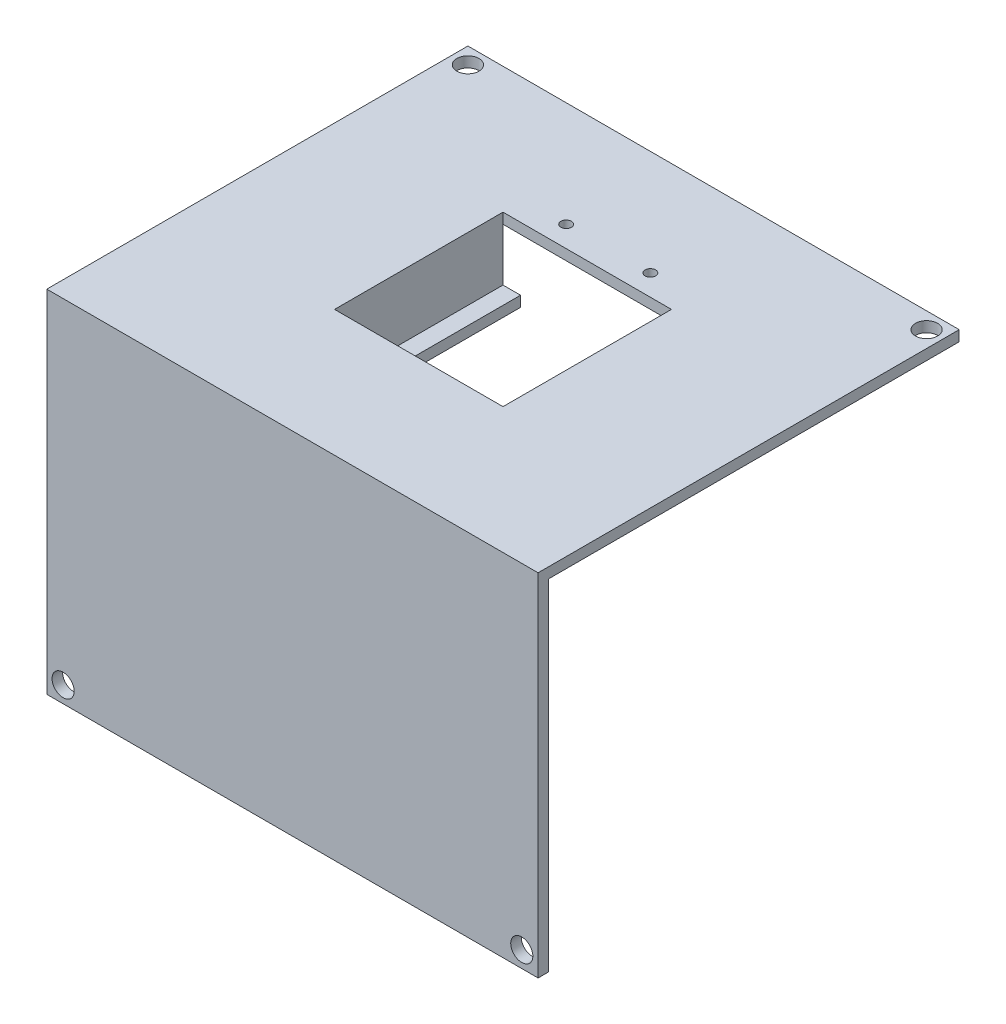
ISO-10303-21;
HEADER;
FILE_DESCRIPTION(('STEP AP214'),'2;1');
FILE_NAME('part.step','',(''),(''),'','','');
FILE_SCHEMA(('AUTOMOTIVE_DESIGN { 1 0 10303 214 1 1 1 1 }'));
ENDSEC;
DATA;
#1=APPLICATION_CONTEXT('core data for automotive mechanical design processes');
#2=APPLICATION_PROTOCOL_DEFINITION('international standard','automotive_design',2000,#1);
#3=PRODUCT_CONTEXT('',#1,'mechanical');
#4=PRODUCT('Part','Part','',(#3));
#5=PRODUCT_RELATED_PRODUCT_CATEGORY('part','',(#4));
#6=PRODUCT_DEFINITION_FORMATION('','',#4);
#7=PRODUCT_DEFINITION_CONTEXT('part definition',#1,'design');
#8=PRODUCT_DEFINITION('design','',#6,#7);
#9=PRODUCT_DEFINITION_SHAPE('','',#8);
#10=(LENGTH_UNIT() NAMED_UNIT(*) SI_UNIT(.MILLI.,.METRE.));
#11=(NAMED_UNIT(*) PLANE_ANGLE_UNIT() SI_UNIT($,.RADIAN.));
#12=(NAMED_UNIT(*) SI_UNIT($,.STERADIAN.) SOLID_ANGLE_UNIT());
#13=UNCERTAINTY_MEASURE_WITH_UNIT(LENGTH_MEASURE(1.E-05),#10,'distance_accuracy_value','');
#14=(GEOMETRIC_REPRESENTATION_CONTEXT(3) GLOBAL_UNCERTAINTY_ASSIGNED_CONTEXT((#13)) GLOBAL_UNIT_ASSIGNED_CONTEXT((#10,
#11,#12)) REPRESENTATION_CONTEXT('',''));
#15=CARTESIAN_POINT('',(0.,0.,0.));
#16=DIRECTION('',(0.,0.,1.));
#17=DIRECTION('',(1.,0.,0.));
#18=AXIS2_PLACEMENT_3D('',#15,#16,#17);
#19=CARTESIAN_POINT('',(0.,97.,0.));
#20=DIRECTION('',(0.,1.,0.));
#21=DIRECTION('',(0.,0.,1.));
#22=AXIS2_PLACEMENT_3D('',#19,#20,#21);
#23=PLANE('',#22);
#24=CARTESIAN_POINT('',(-12.,97.,-30.));
#25=DIRECTION('',(0.,-1.,0.));
#26=DIRECTION('',(0.,0.,-1.));
#27=AXIS2_PLACEMENT_3D('',#24,#25,#26);
#28=CIRCLE('',#27,1.49999999999999);
#29=CARTESIAN_POINT('',(-12.,97.,-31.5));
#30=VERTEX_POINT('',#29);
#31=EDGE_CURVE('E577',#30,#30,#28,.T.);
#32=ORIENTED_EDGE('',*,*,#31,.F.);
#33=EDGE_LOOP('',(#32));
#34=FACE_BOUND('',#33,.T.);
#35=CARTESIAN_POINT('',(12.,97.,-30.));
#36=DIRECTION('',(0.,-1.,0.));
#37=DIRECTION('',(0.,0.,-1.));
#38=AXIS2_PLACEMENT_3D('',#35,#36,#37);
#39=CIRCLE('',#38,1.49999999999999);
#40=CARTESIAN_POINT('',(12.,97.,-31.5));
#41=VERTEX_POINT('',#40);
#42=EDGE_CURVE('E581',#41,#41,#39,.T.);
#43=ORIENTED_EDGE('',*,*,#42,.F.);
#44=EDGE_LOOP('',(#43));
#45=FACE_BOUND('',#44,.T.);
#46=CARTESIAN_POINT('',(65.35,97.,-55.35));
#47=DIRECTION('',(0.,1.,0.));
#48=DIRECTION('',(0.,0.,1.));
#49=AXIS2_PLACEMENT_3D('',#46,#47,#48);
#50=CIRCLE('',#49,3.15);
#51=CARTESIAN_POINT('',(65.35,97.,-52.2));
#52=VERTEX_POINT('',#51);
#53=EDGE_CURVE('E349',#52,#52,#50,.T.);
#54=ORIENTED_EDGE('',*,*,#53,.T.);
#55=EDGE_LOOP('',(#54));
#56=FACE_BOUND('',#55,.T.);
#57=CARTESIAN_POINT('',(-65.3500000000001,97.,-55.35));
#58=DIRECTION('',(0.,1.,0.));
#59=DIRECTION('',(0.,0.,1.));
#60=AXIS2_PLACEMENT_3D('',#57,#58,#59);
#61=CIRCLE('',#60,3.15);
#62=CARTESIAN_POINT('',(-65.3500000000001,97.,-52.2));
#63=VERTEX_POINT('',#62);
#64=EDGE_CURVE('E338',#63,#63,#61,.T.);
#65=ORIENTED_EDGE('',*,*,#64,.T.);
#66=EDGE_LOOP('',(#65));
#67=FACE_BOUND('',#66,.T.);
#68=DIRECTION('',(0.,0.,-1.));
#69=VECTOR('',#68,1.);
#70=CARTESIAN_POINT('',(70.,97.,-60.));
#71=LINE('',#70,#69);
#72=CARTESIAN_POINT('',(70.,97.,57.));
#73=VERTEX_POINT('',#72);
#74=CARTESIAN_POINT('',(70.,97.,-60.));
#75=VERTEX_POINT('',#74);
#76=EDGE_CURVE('E389',#73,#75,#71,.T.);
#77=ORIENTED_EDGE('',*,*,#76,.F.);
#78=DIRECTION('',(1.,0.,0.));
#79=VECTOR('',#78,1.);
#80=CARTESIAN_POINT('',(-70.,97.,57.));
#81=LINE('',#80,#79);
#82=CARTESIAN_POINT('',(-70.,97.,57.));
#83=VERTEX_POINT('',#82);
#84=EDGE_CURVE('E381',#83,#73,#81,.T.);
#85=ORIENTED_EDGE('',*,*,#84,.F.);
#86=DIRECTION('',(0.,0.,1.));
#87=VECTOR('',#86,1.);
#88=CARTESIAN_POINT('',(-70.,97.,-60.));
#89=LINE('',#88,#87);
#90=CARTESIAN_POINT('',(-70.,97.,-60.));
#91=VERTEX_POINT('',#90);
#92=EDGE_CURVE('E385',#91,#83,#89,.T.);
#93=ORIENTED_EDGE('',*,*,#92,.F.);
#94=DIRECTION('',(-1.,0.,0.));
#95=VECTOR('',#94,1.);
#96=CARTESIAN_POINT('',(-70.,97.,-60.));
#97=LINE('',#96,#95);
#98=EDGE_CURVE('E398',#75,#91,#97,.T.);
#99=ORIENTED_EDGE('',*,*,#98,.F.);
#100=EDGE_LOOP('',(#77,#85,#93,#99));
#101=FACE_BOUND('',#100,.T.);
#102=DIRECTION('',(-1.,0.,0.));
#103=VECTOR('',#102,1.);
#104=CARTESIAN_POINT('',(-24.,97.,24.));
#105=LINE('',#104,#103);
#106=CARTESIAN_POINT('',(-24.,97.,24.));
#107=VERTEX_POINT('',#106);
#108=CARTESIAN_POINT('',(-29.,97.,24.));
#109=VERTEX_POINT('',#108);
#110=EDGE_CURVE('E186',#107,#109,#105,.T.);
#111=ORIENTED_EDGE('',*,*,#110,.F.);
#112=DIRECTION('',(-1.,0.,0.));
#113=VECTOR('',#112,1.);
#114=CARTESIAN_POINT('',(-24.,97.,24.));
#115=LINE('',#114,#113);
#116=CARTESIAN_POINT('',(24.,97.,24.));
#117=VERTEX_POINT('',#116);
#118=EDGE_CURVE('E311',#117,#107,#115,.T.);
#119=ORIENTED_EDGE('',*,*,#118,.F.);
#120=DIRECTION('',(-1.,0.,0.));
#121=VECTOR('',#120,1.);
#122=CARTESIAN_POINT('',(24.,97.,24.));
#123=LINE('',#122,#121);
#124=CARTESIAN_POINT('',(29.,97.,24.));
#125=VERTEX_POINT('',#124);
#126=EDGE_CURVE('E291',#125,#117,#123,.T.);
#127=ORIENTED_EDGE('',*,*,#126,.F.);
#128=DIRECTION('',(0.,0.,1.));
#129=VECTOR('',#128,1.);
#130=CARTESIAN_POINT('',(29.,97.,24.));
#131=LINE('',#130,#129);
#132=CARTESIAN_POINT('',(29.,97.,-24.));
#133=VERTEX_POINT('',#132);
#134=EDGE_CURVE('E295',#133,#125,#131,.T.);
#135=ORIENTED_EDGE('',*,*,#134,.F.);
#136=DIRECTION('',(1.,0.,0.));
#137=VECTOR('',#136,1.);
#138=CARTESIAN_POINT('',(29.,97.,-24.));
#139=LINE('',#138,#137);
#140=CARTESIAN_POINT('',(24.,97.,-24.));
#141=VERTEX_POINT('',#140);
#142=EDGE_CURVE('E190',#141,#133,#139,.T.);
#143=ORIENTED_EDGE('',*,*,#142,.F.);
#144=DIRECTION('',(1.,0.,0.));
#145=VECTOR('',#144,1.);
#146=CARTESIAN_POINT('',(-24.,97.,-24.));
#147=LINE('',#146,#145);
#148=CARTESIAN_POINT('',(-24.,97.,-24.));
#149=VERTEX_POINT('',#148);
#150=EDGE_CURVE('E317',#149,#141,#147,.T.);
#151=ORIENTED_EDGE('',*,*,#150,.F.);
#152=DIRECTION('',(1.,0.,0.));
#153=VECTOR('',#152,1.);
#154=CARTESIAN_POINT('',(-29.,97.,-24.));
#155=LINE('',#154,#153);
#156=CARTESIAN_POINT('',(-29.,97.,-24.));
#157=VERTEX_POINT('',#156);
#158=EDGE_CURVE('E270',#157,#149,#155,.T.);
#159=ORIENTED_EDGE('',*,*,#158,.F.);
#160=DIRECTION('',(0.,0.,-1.));
#161=VECTOR('',#160,1.);
#162=CARTESIAN_POINT('',(-29.,97.,24.));
#163=LINE('',#162,#161);
#164=EDGE_CURVE('E273',#109,#157,#163,.T.);
#165=ORIENTED_EDGE('',*,*,#164,.F.);
#166=EDGE_LOOP('',(#111,#119,#127,#135,#143,#151,#159,#165));
#167=FACE_BOUND('',#166,.T.);
#168=ADVANCED_FACE('F39',(#34,#45,#56,#67,#101,#167),#23,.F.);
#169=CARTESIAN_POINT('',(70.,100.,-60.));
#170=DIRECTION('',(-1.,0.,0.));
#171=DIRECTION('',(0.,0.,1.));
#172=AXIS2_PLACEMENT_3D('',#169,#170,#171);
#173=PLANE('',#172);
#174=DIRECTION('',(0.,-1.,0.));
#175=VECTOR('',#174,1.);
#176=CARTESIAN_POINT('',(70.,100.,57.));
#177=LINE('',#176,#175);
#178=CARTESIAN_POINT('',(70.,0.,57.));
#179=VERTEX_POINT('',#178);
#180=EDGE_CURVE('E384',#73,#179,#177,.T.);
#181=ORIENTED_EDGE('',*,*,#180,.F.);
#182=ORIENTED_EDGE('',*,*,#76,.T.);
#183=DIRECTION('',(0.,-1.,0.));
#184=VECTOR('',#183,1.);
#185=CARTESIAN_POINT('',(70.,100.,-60.));
#186=LINE('',#185,#184);
#187=CARTESIAN_POINT('',(70.,100.,-60.));
#188=VERTEX_POINT('',#187);
#189=EDGE_CURVE('E11',#188,#75,#186,.T.);
#190=ORIENTED_EDGE('',*,*,#189,.F.);
#191=DIRECTION('',(0.,0.,-1.));
#192=VECTOR('',#191,1.);
#193=CARTESIAN_POINT('',(70.,100.,-60.));
#194=LINE('',#193,#192);
#195=CARTESIAN_POINT('',(70.,100.,60.));
#196=VERTEX_POINT('',#195);
#197=EDGE_CURVE('E407',#196,#188,#194,.T.);
#198=ORIENTED_EDGE('',*,*,#197,.F.);
#199=DIRECTION('',(0.,-1.,0.));
#200=VECTOR('',#199,1.);
#201=CARTESIAN_POINT('',(70.,100.,60.));
#202=LINE('',#201,#200);
#203=CARTESIAN_POINT('',(70.,0.,60.));
#204=VERTEX_POINT('',#203);
#205=EDGE_CURVE('E421',#196,#204,#202,.T.);
#206=ORIENTED_EDGE('',*,*,#205,.T.);
#207=DIRECTION('',(0.,0.,-1.));
#208=VECTOR('',#207,1.);
#209=CARTESIAN_POINT('',(70.,0.,-60.));
#210=LINE('',#209,#208);
#211=EDGE_CURVE('E394',#204,#179,#210,.T.);
#212=ORIENTED_EDGE('',*,*,#211,.T.);
#213=EDGE_LOOP('',(#181,#182,#190,#198,#206,#212));
#214=FACE_BOUND('',#213,.T.);
#215=ADVANCED_FACE('F41',(#214),#173,.F.);
#216=CARTESIAN_POINT('',(-70.,100.,-60.));
#217=DIRECTION('',(0.,0.,1.));
#218=DIRECTION('',(1.,0.,0.));
#219=AXIS2_PLACEMENT_3D('',#216,#217,#218);
#220=PLANE('',#219);
#221=ORIENTED_EDGE('',*,*,#189,.T.);
#222=ORIENTED_EDGE('',*,*,#98,.T.);
#223=DIRECTION('',(0.,-1.,0.));
#224=VECTOR('',#223,1.);
#225=CARTESIAN_POINT('',(-70.,100.,-60.));
#226=LINE('',#225,#224);
#227=CARTESIAN_POINT('',(-70.,100.,-60.));
#228=VERTEX_POINT('',#227);
#229=EDGE_CURVE('E49',#228,#91,#226,.T.);
#230=ORIENTED_EDGE('',*,*,#229,.F.);
#231=DIRECTION('',(-1.,0.,0.));
#232=VECTOR('',#231,1.);
#233=CARTESIAN_POINT('',(-70.,100.,-60.));
#234=LINE('',#233,#232);
#235=EDGE_CURVE('E411',#188,#228,#234,.T.);
#236=ORIENTED_EDGE('',*,*,#235,.F.);
#237=EDGE_LOOP('',(#221,#222,#230,#236));
#238=FACE_BOUND('',#237,.T.);
#239=ADVANCED_FACE('F445',(#238),#220,.F.);
#240=CARTESIAN_POINT('',(-70.,100.,-60.));
#241=DIRECTION('',(1.,0.,0.));
#242=DIRECTION('',(0.,0.,-1.));
#243=AXIS2_PLACEMENT_3D('',#240,#241,#242);
#244=PLANE('',#243);
#245=ORIENTED_EDGE('',*,*,#92,.T.);
#246=DIRECTION('',(0.,-1.,0.));
#247=VECTOR('',#246,1.);
#248=CARTESIAN_POINT('',(-70.,100.,57.));
#249=LINE('',#248,#247);
#250=CARTESIAN_POINT('',(-70.,0.,57.));
#251=VERTEX_POINT('',#250);
#252=EDGE_CURVE('E390',#83,#251,#249,.T.);
#253=ORIENTED_EDGE('',*,*,#252,.T.);
#254=DIRECTION('',(0.,0.,1.));
#255=VECTOR('',#254,1.);
#256=CARTESIAN_POINT('',(-70.,0.,-60.));
#257=LINE('',#256,#255);
#258=CARTESIAN_POINT('',(-70.,0.,60.));
#259=VERTEX_POINT('',#258);
#260=EDGE_CURVE('E425',#251,#259,#257,.T.);
#261=ORIENTED_EDGE('',*,*,#260,.T.);
#262=DIRECTION('',(0.,-1.,0.));
#263=VECTOR('',#262,1.);
#264=CARTESIAN_POINT('',(-70.,100.,60.));
#265=LINE('',#264,#263);
#266=CARTESIAN_POINT('',(-70.,100.,60.));
#267=VERTEX_POINT('',#266);
#268=EDGE_CURVE('E433',#267,#259,#265,.T.);
#269=ORIENTED_EDGE('',*,*,#268,.F.);
#270=DIRECTION('',(0.,0.,1.));
#271=VECTOR('',#270,1.);
#272=CARTESIAN_POINT('',(-70.,100.,-60.));
#273=LINE('',#272,#271);
#274=EDGE_CURVE('E415',#228,#267,#273,.T.);
#275=ORIENTED_EDGE('',*,*,#274,.F.);
#276=ORIENTED_EDGE('',*,*,#229,.T.);
#277=EDGE_LOOP('',(#245,#253,#261,#269,#275,#276));
#278=FACE_BOUND('',#277,.T.);
#279=ADVANCED_FACE('F442',(#278),#244,.F.);
#280=CARTESIAN_POINT('',(-70.,100.,60.));
#281=DIRECTION('',(0.,0.,-1.));
#282=DIRECTION('',(-1.,0.,0.));
#283=AXIS2_PLACEMENT_3D('',#280,#281,#282);
#284=PLANE('',#283);
#285=CARTESIAN_POINT('',(65.35,4.65,60.));
#286=DIRECTION('',(0.,0.,1.));
#287=DIRECTION('',(1.,0.,0.));
#288=AXIS2_PLACEMENT_3D('',#285,#286,#287);
#289=CIRCLE('',#288,3.15);
#290=CARTESIAN_POINT('',(68.5,4.65,60.));
#291=VERTEX_POINT('',#290);
#292=EDGE_CURVE('E370',#291,#291,#289,.T.);
#293=ORIENTED_EDGE('',*,*,#292,.F.);
#294=EDGE_LOOP('',(#293));
#295=FACE_BOUND('',#294,.T.);
#296=CARTESIAN_POINT('',(-65.35,4.65,60.));
#297=DIRECTION('',(0.,0.,1.));
#298=DIRECTION('',(1.,0.,0.));
#299=AXIS2_PLACEMENT_3D('',#296,#297,#298);
#300=CIRCLE('',#299,3.15);
#301=CARTESIAN_POINT('',(-62.2,4.65,60.));
#302=VERTEX_POINT('',#301);
#303=EDGE_CURVE('E374',#302,#302,#300,.T.);
#304=ORIENTED_EDGE('',*,*,#303,.F.);
#305=EDGE_LOOP('',(#304));
#306=FACE_BOUND('',#305,.T.);
#307=DIRECTION('',(1.,0.,0.));
#308=VECTOR('',#307,1.);
#309=CARTESIAN_POINT('',(-70.,0.,60.));
#310=LINE('',#309,#308);
#311=EDGE_CURVE('E412',#259,#204,#310,.T.);
#312=ORIENTED_EDGE('',*,*,#311,.T.);
#313=ORIENTED_EDGE('',*,*,#205,.F.);
#314=DIRECTION('',(1.,0.,0.));
#315=VECTOR('',#314,1.);
#316=CARTESIAN_POINT('',(-70.,100.,60.));
#317=LINE('',#316,#315);
#318=EDGE_CURVE('E418',#267,#196,#317,.T.);
#319=ORIENTED_EDGE('',*,*,#318,.F.);
#320=ORIENTED_EDGE('',*,*,#268,.T.);
#321=EDGE_LOOP('',(#312,#313,#319,#320));
#322=FACE_BOUND('',#321,.T.);
#323=ADVANCED_FACE('F463',(#295,#306,#322),#284,.F.);
#324=CARTESIAN_POINT('',(0.,100.,0.));
#325=DIRECTION('',(0.,1.,0.));
#326=DIRECTION('',(0.,0.,1.));
#327=AXIS2_PLACEMENT_3D('',#324,#325,#326);
#328=PLANE('',#327);
#329=CARTESIAN_POINT('',(-12.,100.,-30.));
#330=DIRECTION('',(0.,1.,0.));
#331=DIRECTION('',(0.,0.,1.));
#332=AXIS2_PLACEMENT_3D('',#329,#330,#331);
#333=CIRCLE('',#332,1.49999999999999);
#334=CARTESIAN_POINT('',(-12.,100.,-28.5));
#335=VERTEX_POINT('',#334);
#336=EDGE_CURVE('E43',#335,#335,#333,.T.);
#337=ORIENTED_EDGE('',*,*,#336,.F.);
#338=EDGE_LOOP('',(#337));
#339=FACE_BOUND('',#338,.T.);
#340=CARTESIAN_POINT('',(12.,100.,-30.));
#341=DIRECTION('',(0.,1.,0.));
#342=DIRECTION('',(0.,0.,1.));
#343=AXIS2_PLACEMENT_3D('',#340,#341,#342);
#344=CIRCLE('',#343,1.49999999999999);
#345=CARTESIAN_POINT('',(12.,100.,-28.5));
#346=VERTEX_POINT('',#345);
#347=EDGE_CURVE('E213',#346,#346,#344,.T.);
#348=ORIENTED_EDGE('',*,*,#347,.F.);
#349=EDGE_LOOP('',(#348));
#350=FACE_BOUND('',#349,.T.);
#351=DIRECTION('',(0.,0.,1.));
#352=VECTOR('',#351,1.);
#353=CARTESIAN_POINT('',(24.,100.,-24.));
#354=LINE('',#353,#352);
#355=CARTESIAN_POINT('',(24.,100.,-24.));
#356=VERTEX_POINT('',#355);
#357=CARTESIAN_POINT('',(24.,100.,24.));
#358=VERTEX_POINT('',#357);
#359=EDGE_CURVE('E312',#356,#358,#354,.T.);
#360=ORIENTED_EDGE('',*,*,#359,.T.);
#361=DIRECTION('',(-1.,0.,0.));
#362=VECTOR('',#361,1.);
#363=CARTESIAN_POINT('',(-24.,100.,24.));
#364=LINE('',#363,#362);
#365=CARTESIAN_POINT('',(-24.,100.,24.));
#366=VERTEX_POINT('',#365);
#367=EDGE_CURVE('E316',#358,#366,#364,.T.);
#368=ORIENTED_EDGE('',*,*,#367,.T.);
#369=DIRECTION('',(0.,0.,-1.));
#370=VECTOR('',#369,1.);
#371=CARTESIAN_POINT('',(-24.,100.,-24.));
#372=LINE('',#371,#370);
#373=CARTESIAN_POINT('',(-24.,100.,-24.));
#374=VERTEX_POINT('',#373);
#375=EDGE_CURVE('E56',#366,#374,#372,.T.);
#376=ORIENTED_EDGE('',*,*,#375,.T.);
#377=DIRECTION('',(1.,0.,0.));
#378=VECTOR('',#377,1.);
#379=CARTESIAN_POINT('',(-24.,100.,-24.));
#380=LINE('',#379,#378);
#381=EDGE_CURVE('E323',#374,#356,#380,.T.);
#382=ORIENTED_EDGE('',*,*,#381,.T.);
#383=EDGE_LOOP('',(#360,#368,#376,#382));
#384=FACE_BOUND('',#383,.T.);
#385=CARTESIAN_POINT('',(65.35,100.,-55.35));
#386=DIRECTION('',(0.,1.,0.));
#387=DIRECTION('',(0.,0.,1.));
#388=AXIS2_PLACEMENT_3D('',#385,#386,#387);
#389=CIRCLE('',#388,3.15);
#390=CARTESIAN_POINT('',(65.35,100.,-52.2));
#391=VERTEX_POINT('',#390);
#392=EDGE_CURVE('E354',#391,#391,#389,.T.);
#393=ORIENTED_EDGE('',*,*,#392,.F.);
#394=EDGE_LOOP('',(#393));
#395=FACE_BOUND('',#394,.T.);
#396=CARTESIAN_POINT('',(-65.3500000000001,100.,-55.35));
#397=DIRECTION('',(0.,1.,0.));
#398=DIRECTION('',(0.,0.,1.));
#399=AXIS2_PLACEMENT_3D('',#396,#397,#398);
#400=CIRCLE('',#399,3.15);
#401=CARTESIAN_POINT('',(-65.3500000000001,100.,-52.2));
#402=VERTEX_POINT('',#401);
#403=EDGE_CURVE('E358',#402,#402,#400,.T.);
#404=ORIENTED_EDGE('',*,*,#403,.F.);
#405=EDGE_LOOP('',(#404));
#406=FACE_BOUND('',#405,.T.);
#407=ORIENTED_EDGE('',*,*,#197,.T.);
#408=ORIENTED_EDGE('',*,*,#235,.T.);
#409=ORIENTED_EDGE('',*,*,#274,.T.);
#410=ORIENTED_EDGE('',*,*,#318,.T.);
#411=EDGE_LOOP('',(#407,#408,#409,#410));
#412=FACE_BOUND('',#411,.T.);
#413=ADVANCED_FACE('F466',(#339,#350,#384,#395,#406,#412),#328,.T.);
#414=CARTESIAN_POINT('',(0.,0.,0.));
#415=DIRECTION('',(0.,1.,0.));
#416=DIRECTION('',(0.,0.,1.));
#417=AXIS2_PLACEMENT_3D('',#414,#415,#416);
#418=PLANE('',#417);
#419=ORIENTED_EDGE('',*,*,#260,.F.);
#420=DIRECTION('',(1.,0.,0.));
#421=VECTOR('',#420,1.);
#422=CARTESIAN_POINT('',(-70.,0.,57.));
#423=LINE('',#422,#421);
#424=EDGE_CURVE('E369',#251,#179,#423,.T.);
#425=ORIENTED_EDGE('',*,*,#424,.T.);
#426=ORIENTED_EDGE('',*,*,#211,.F.);
#427=ORIENTED_EDGE('',*,*,#311,.F.);
#428=EDGE_LOOP('',(#419,#425,#426,#427));
#429=FACE_BOUND('',#428,.T.);
#430=ADVANCED_FACE('F459',(#429),#418,.F.);
#431=CARTESIAN_POINT('',(-70.,100.,57.));
#432=DIRECTION('',(0.,0.,-1.));
#433=DIRECTION('',(-1.,0.,0.));
#434=AXIS2_PLACEMENT_3D('',#431,#432,#433);
#435=PLANE('',#434);
#436=CARTESIAN_POINT('',(65.35,4.65,57.));
#437=DIRECTION('',(0.,0.,1.));
#438=DIRECTION('',(1.,0.,0.));
#439=AXIS2_PLACEMENT_3D('',#436,#437,#438);
#440=CIRCLE('',#439,3.15);
#441=CARTESIAN_POINT('',(68.5,4.65,57.));
#442=VERTEX_POINT('',#441);
#443=EDGE_CURVE('E365',#442,#442,#440,.T.);
#444=ORIENTED_EDGE('',*,*,#443,.T.);
#445=EDGE_LOOP('',(#444));
#446=FACE_BOUND('',#445,.T.);
#447=CARTESIAN_POINT('',(-65.35,4.65,57.));
#448=DIRECTION('',(0.,0.,1.));
#449=DIRECTION('',(1.,0.,0.));
#450=AXIS2_PLACEMENT_3D('',#447,#448,#449);
#451=CIRCLE('',#450,3.15);
#452=CARTESIAN_POINT('',(-62.2,4.65,57.));
#453=VERTEX_POINT('',#452);
#454=EDGE_CURVE('E353',#453,#453,#451,.T.);
#455=ORIENTED_EDGE('',*,*,#454,.T.);
#456=EDGE_LOOP('',(#455));
#457=FACE_BOUND('',#456,.T.);
#458=ORIENTED_EDGE('',*,*,#424,.F.);
#459=ORIENTED_EDGE('',*,*,#252,.F.);
#460=ORIENTED_EDGE('',*,*,#84,.T.);
#461=ORIENTED_EDGE('',*,*,#180,.T.);
#462=EDGE_LOOP('',(#458,#459,#460,#461));
#463=FACE_BOUND('',#462,.T.);
#464=ADVANCED_FACE('F456',(#446,#457,#463),#435,.T.);
#465=CARTESIAN_POINT('',(-65.35,4.65,57.));
#466=DIRECTION('',(0.,0.,1.));
#467=DIRECTION('',(1.,0.,0.));
#468=AXIS2_PLACEMENT_3D('',#465,#466,#467);
#469=CYLINDRICAL_SURFACE('',#468,3.15);
#470=ORIENTED_EDGE('',*,*,#454,.F.);
#471=EDGE_LOOP('',(#470));
#472=FACE_BOUND('',#471,.T.);
#473=ORIENTED_EDGE('',*,*,#303,.T.);
#474=EDGE_LOOP('',(#473));
#475=FACE_BOUND('',#474,.T.);
#476=ADVANCED_FACE('F492',(#472,#475),#469,.F.);
#477=CARTESIAN_POINT('',(65.35,4.65,57.));
#478=DIRECTION('',(0.,0.,1.));
#479=DIRECTION('',(1.,0.,0.));
#480=AXIS2_PLACEMENT_3D('',#477,#478,#479);
#481=CYLINDRICAL_SURFACE('',#480,3.15);
#482=ORIENTED_EDGE('',*,*,#443,.F.);
#483=EDGE_LOOP('',(#482));
#484=FACE_BOUND('',#483,.T.);
#485=ORIENTED_EDGE('',*,*,#292,.T.);
#486=EDGE_LOOP('',(#485));
#487=FACE_BOUND('',#486,.T.);
#488=ADVANCED_FACE('F496',(#484,#487),#481,.F.);
#489=CARTESIAN_POINT('',(-65.3500000000001,97.,-55.35));
#490=DIRECTION('',(0.,1.,0.));
#491=DIRECTION('',(0.,0.,1.));
#492=AXIS2_PLACEMENT_3D('',#489,#490,#491);
#493=CYLINDRICAL_SURFACE('',#492,3.15);
#494=ORIENTED_EDGE('',*,*,#64,.F.);
#495=EDGE_LOOP('',(#494));
#496=FACE_BOUND('',#495,.T.);
#497=ORIENTED_EDGE('',*,*,#403,.T.);
#498=EDGE_LOOP('',(#497));
#499=FACE_BOUND('',#498,.T.);
#500=ADVANCED_FACE('F500',(#496,#499),#493,.F.);
#501=CARTESIAN_POINT('',(65.35,97.,-55.35));
#502=DIRECTION('',(0.,1.,0.));
#503=DIRECTION('',(0.,0.,1.));
#504=AXIS2_PLACEMENT_3D('',#501,#502,#503);
#505=CYLINDRICAL_SURFACE('',#504,3.15);
#506=ORIENTED_EDGE('',*,*,#53,.F.);
#507=EDGE_LOOP('',(#506));
#508=FACE_BOUND('',#507,.T.);
#509=ORIENTED_EDGE('',*,*,#392,.T.);
#510=EDGE_LOOP('',(#509));
#511=FACE_BOUND('',#510,.T.);
#512=ADVANCED_FACE('F504',(#508,#511),#505,.F.);
#513=CARTESIAN_POINT('',(24.,100.,-24.));
#514=DIRECTION('',(1.,0.,0.));
#515=DIRECTION('',(0.,0.,-1.));
#516=AXIS2_PLACEMENT_3D('',#513,#514,#515);
#517=PLANE('',#516);
#518=DIRECTION('',(0.,-1.,0.));
#519=VECTOR('',#518,1.);
#520=CARTESIAN_POINT('',(24.,100.,-24.));
#521=LINE('',#520,#519);
#522=EDGE_CURVE('E334',#356,#141,#521,.T.);
#523=ORIENTED_EDGE('',*,*,#522,.T.);
#524=DIRECTION('',(0.,1.,0.));
#525=VECTOR('',#524,1.);
#526=CARTESIAN_POINT('',(24.,82.,-24.));
#527=LINE('',#526,#525);
#528=CARTESIAN_POINT('',(24.,82.,-24.));
#529=VERTEX_POINT('',#528);
#530=EDGE_CURVE('E290',#529,#141,#527,.T.);
#531=ORIENTED_EDGE('',*,*,#530,.F.);
#532=DIRECTION('',(0.,0.,-1.));
#533=VECTOR('',#532,1.);
#534=CARTESIAN_POINT('',(24.,82.,-24.));
#535=LINE('',#534,#533);
#536=CARTESIAN_POINT('',(24.,82.,24.));
#537=VERTEX_POINT('',#536);
#538=EDGE_CURVE('E286',#537,#529,#535,.T.);
#539=ORIENTED_EDGE('',*,*,#538,.F.);
#540=DIRECTION('',(0.,1.,0.));
#541=VECTOR('',#540,1.);
#542=CARTESIAN_POINT('',(24.,82.,24.));
#543=LINE('',#542,#541);
#544=EDGE_CURVE('E64',#537,#117,#543,.T.);
#545=ORIENTED_EDGE('',*,*,#544,.T.);
#546=DIRECTION('',(0.,-1.,0.));
#547=VECTOR('',#546,1.);
#548=CARTESIAN_POINT('',(24.,100.,24.));
#549=LINE('',#548,#547);
#550=EDGE_CURVE('E327',#358,#117,#549,.T.);
#551=ORIENTED_EDGE('',*,*,#550,.F.);
#552=ORIENTED_EDGE('',*,*,#359,.F.);
#553=EDGE_LOOP('',(#523,#531,#539,#545,#551,#552));
#554=FACE_BOUND('',#553,.T.);
#555=ADVANCED_FACE('F508',(#554),#517,.F.);
#556=CARTESIAN_POINT('',(-24.,100.,-24.));
#557=DIRECTION('',(0.,0.,-1.));
#558=DIRECTION('',(-1.,0.,0.));
#559=AXIS2_PLACEMENT_3D('',#556,#557,#558);
#560=PLANE('',#559);
#561=ORIENTED_EDGE('',*,*,#150,.T.);
#562=ORIENTED_EDGE('',*,*,#522,.F.);
#563=ORIENTED_EDGE('',*,*,#381,.F.);
#564=DIRECTION('',(0.,-1.,0.));
#565=VECTOR('',#564,1.);
#566=CARTESIAN_POINT('',(-24.,100.,-24.));
#567=LINE('',#566,#565);
#568=EDGE_CURVE('E339',#374,#149,#567,.T.);
#569=ORIENTED_EDGE('',*,*,#568,.T.);
#570=EDGE_LOOP('',(#561,#562,#563,#569));
#571=FACE_BOUND('',#570,.T.);
#572=ADVANCED_FACE('F512',(#571),#560,.F.);
#573=CARTESIAN_POINT('',(-24.,100.,-24.));
#574=DIRECTION('',(-1.,0.,0.));
#575=DIRECTION('',(0.,0.,1.));
#576=AXIS2_PLACEMENT_3D('',#573,#574,#575);
#577=PLANE('',#576);
#578=DIRECTION('',(0.,-1.,0.));
#579=VECTOR('',#578,1.);
#580=CARTESIAN_POINT('',(-24.,100.,24.));
#581=LINE('',#580,#579);
#582=EDGE_CURVE('E343',#366,#107,#581,.T.);
#583=ORIENTED_EDGE('',*,*,#582,.T.);
#584=DIRECTION('',(0.,1.,0.));
#585=VECTOR('',#584,1.);
#586=CARTESIAN_POINT('',(-24.,82.,24.));
#587=LINE('',#586,#585);
#588=CARTESIAN_POINT('',(-24.,82.,24.));
#589=VERTEX_POINT('',#588);
#590=EDGE_CURVE('E269',#589,#107,#587,.T.);
#591=ORIENTED_EDGE('',*,*,#590,.F.);
#592=DIRECTION('',(0.,0.,1.));
#593=VECTOR('',#592,1.);
#594=CARTESIAN_POINT('',(-24.,82.,-24.));
#595=LINE('',#594,#593);
#596=CARTESIAN_POINT('',(-24.,82.,-24.));
#597=VERTEX_POINT('',#596);
#598=EDGE_CURVE('E265',#597,#589,#595,.T.);
#599=ORIENTED_EDGE('',*,*,#598,.F.);
#600=DIRECTION('',(0.,1.,0.));
#601=VECTOR('',#600,1.);
#602=CARTESIAN_POINT('',(-24.,82.,-24.));
#603=LINE('',#602,#601);
#604=EDGE_CURVE('E281',#597,#149,#603,.T.);
#605=ORIENTED_EDGE('',*,*,#604,.T.);
#606=ORIENTED_EDGE('',*,*,#568,.F.);
#607=ORIENTED_EDGE('',*,*,#375,.F.);
#608=EDGE_LOOP('',(#583,#591,#599,#605,#606,#607));
#609=FACE_BOUND('',#608,.T.);
#610=ADVANCED_FACE('F517',(#609),#577,.F.);
#611=CARTESIAN_POINT('',(-24.,100.,24.));
#612=DIRECTION('',(0.,0.,1.));
#613=DIRECTION('',(1.,0.,0.));
#614=AXIS2_PLACEMENT_3D('',#611,#612,#613);
#615=PLANE('',#614);
#616=ORIENTED_EDGE('',*,*,#118,.T.);
#617=ORIENTED_EDGE('',*,*,#582,.F.);
#618=ORIENTED_EDGE('',*,*,#367,.F.);
#619=ORIENTED_EDGE('',*,*,#550,.T.);
#620=EDGE_LOOP('',(#616,#617,#618,#619));
#621=FACE_BOUND('',#620,.T.);
#622=ADVANCED_FACE('F513',(#621),#615,.F.);
#623=CARTESIAN_POINT('',(29.,82.,-24.));
#624=DIRECTION('',(0.,0.,1.));
#625=DIRECTION('',(1.,0.,0.));
#626=AXIS2_PLACEMENT_3D('',#623,#624,#625);
#627=PLANE('',#626);
#628=ORIENTED_EDGE('',*,*,#142,.T.);
#629=DIRECTION('',(0.,1.,0.));
#630=VECTOR('',#629,1.);
#631=CARTESIAN_POINT('',(29.,82.,-24.));
#632=LINE('',#631,#630);
#633=CARTESIAN_POINT('',(29.,79.,-24.));
#634=VERTEX_POINT('',#633);
#635=EDGE_CURVE('E308',#634,#133,#632,.T.);
#636=ORIENTED_EDGE('',*,*,#635,.F.);
#637=DIRECTION('',(1.,0.,0.));
#638=VECTOR('',#637,1.);
#639=CARTESIAN_POINT('',(19.,79.,-24.));
#640=LINE('',#639,#638);
#641=CARTESIAN_POINT('',(19.,79.,-24.));
#642=VERTEX_POINT('',#641);
#643=EDGE_CURVE('E234',#642,#634,#640,.T.);
#644=ORIENTED_EDGE('',*,*,#643,.F.);
#645=DIRECTION('',(0.,1.,0.));
#646=VECTOR('',#645,1.);
#647=CARTESIAN_POINT('',(19.,79.,-24.));
#648=LINE('',#647,#646);
#649=CARTESIAN_POINT('',(19.,82.,-24.));
#650=VERTEX_POINT('',#649);
#651=EDGE_CURVE('E249',#642,#650,#648,.T.);
#652=ORIENTED_EDGE('',*,*,#651,.T.);
#653=DIRECTION('',(1.,0.,0.));
#654=VECTOR('',#653,1.);
#655=CARTESIAN_POINT('',(19.,82.,-24.));
#656=LINE('',#655,#654);
#657=EDGE_CURVE('E233',#650,#529,#656,.T.);
#658=ORIENTED_EDGE('',*,*,#657,.T.);
#659=ORIENTED_EDGE('',*,*,#530,.T.);
#660=EDGE_LOOP('',(#628,#636,#644,#652,#658,#659));
#661=FACE_BOUND('',#660,.T.);
#662=ADVANCED_FACE('F516',(#661),#627,.F.);
#663=CARTESIAN_POINT('',(29.,82.,24.));
#664=DIRECTION('',(-1.,0.,0.));
#665=DIRECTION('',(0.,0.,1.));
#666=AXIS2_PLACEMENT_3D('',#663,#664,#665);
#667=PLANE('',#666);
#668=ORIENTED_EDGE('',*,*,#134,.T.);
#669=DIRECTION('',(0.,1.,0.));
#670=VECTOR('',#669,1.);
#671=CARTESIAN_POINT('',(29.,82.,24.));
#672=LINE('',#671,#670);
#673=CARTESIAN_POINT('',(29.,79.,24.));
#674=VERTEX_POINT('',#673);
#675=EDGE_CURVE('E304',#674,#125,#672,.T.);
#676=ORIENTED_EDGE('',*,*,#675,.F.);
#677=DIRECTION('',(0.,0.,1.));
#678=VECTOR('',#677,1.);
#679=CARTESIAN_POINT('',(29.,79.,-24.));
#680=LINE('',#679,#678);
#681=EDGE_CURVE('E238',#634,#674,#680,.T.);
#682=ORIENTED_EDGE('',*,*,#681,.F.);
#683=ORIENTED_EDGE('',*,*,#635,.T.);
#684=EDGE_LOOP('',(#668,#676,#682,#683));
#685=FACE_BOUND('',#684,.T.);
#686=ADVANCED_FACE('F526',(#685),#667,.F.);
#687=CARTESIAN_POINT('',(24.,82.,24.));
#688=DIRECTION('',(0.,0.,-1.));
#689=DIRECTION('',(-1.,0.,0.));
#690=AXIS2_PLACEMENT_3D('',#687,#688,#689);
#691=PLANE('',#690);
#692=ORIENTED_EDGE('',*,*,#126,.T.);
#693=ORIENTED_EDGE('',*,*,#544,.F.);
#694=DIRECTION('',(-1.,0.,0.));
#695=VECTOR('',#694,1.);
#696=CARTESIAN_POINT('',(29.,82.,24.));
#697=LINE('',#696,#695);
#698=CARTESIAN_POINT('',(19.,82.,24.));
#699=VERTEX_POINT('',#698);
#700=EDGE_CURVE('E253',#537,#699,#697,.T.);
#701=ORIENTED_EDGE('',*,*,#700,.T.);
#702=DIRECTION('',(0.,1.,0.));
#703=VECTOR('',#702,1.);
#704=CARTESIAN_POINT('',(19.,79.,24.));
#705=LINE('',#704,#703);
#706=CARTESIAN_POINT('',(19.,79.,24.));
#707=VERTEX_POINT('',#706);
#708=EDGE_CURVE('E261',#707,#699,#705,.T.);
#709=ORIENTED_EDGE('',*,*,#708,.F.);
#710=DIRECTION('',(-1.,0.,0.));
#711=VECTOR('',#710,1.);
#712=CARTESIAN_POINT('',(29.,79.,24.));
#713=LINE('',#712,#711);
#714=EDGE_CURVE('E243',#674,#707,#713,.T.);
#715=ORIENTED_EDGE('',*,*,#714,.F.);
#716=ORIENTED_EDGE('',*,*,#675,.T.);
#717=EDGE_LOOP('',(#692,#693,#701,#709,#715,#716));
#718=FACE_BOUND('',#717,.T.);
#719=ADVANCED_FACE('F530',(#718),#691,.F.);
#720=CARTESIAN_POINT('',(-24.,82.,24.));
#721=DIRECTION('',(0.,0.,-1.));
#722=DIRECTION('',(-1.,0.,0.));
#723=AXIS2_PLACEMENT_3D('',#720,#721,#722);
#724=PLANE('',#723);
#725=ORIENTED_EDGE('',*,*,#110,.T.);
#726=DIRECTION('',(0.,1.,0.));
#727=VECTOR('',#726,1.);
#728=CARTESIAN_POINT('',(-29.,82.,24.));
#729=LINE('',#728,#727);
#730=CARTESIAN_POINT('',(-29.,79.,24.));
#731=VERTEX_POINT('',#730);
#732=EDGE_CURVE('E179',#731,#109,#729,.T.);
#733=ORIENTED_EDGE('',*,*,#732,.F.);
#734=DIRECTION('',(-1.,0.,0.));
#735=VECTOR('',#734,1.);
#736=CARTESIAN_POINT('',(-29.,79.,24.));
#737=LINE('',#736,#735);
#738=CARTESIAN_POINT('',(-19.,79.,24.));
#739=VERTEX_POINT('',#738);
#740=EDGE_CURVE('E184',#739,#731,#737,.T.);
#741=ORIENTED_EDGE('',*,*,#740,.F.);
#742=DIRECTION('',(0.,1.,0.));
#743=VECTOR('',#742,1.);
#744=CARTESIAN_POINT('',(-19.,79.,24.));
#745=LINE('',#744,#743);
#746=CARTESIAN_POINT('',(-19.,82.,24.));
#747=VERTEX_POINT('',#746);
#748=EDGE_CURVE('E220',#739,#747,#745,.T.);
#749=ORIENTED_EDGE('',*,*,#748,.T.);
#750=DIRECTION('',(-1.,0.,0.));
#751=VECTOR('',#750,1.);
#752=CARTESIAN_POINT('',(-29.,82.,24.));
#753=LINE('',#752,#751);
#754=EDGE_CURVE('E221',#747,#589,#753,.T.);
#755=ORIENTED_EDGE('',*,*,#754,.T.);
#756=ORIENTED_EDGE('',*,*,#590,.T.);
#757=EDGE_LOOP('',(#725,#733,#741,#749,#755,#756));
#758=FACE_BOUND('',#757,.T.);
#759=ADVANCED_FACE('F181',(#758),#724,.F.);
#760=CARTESIAN_POINT('',(-29.,82.,24.));
#761=DIRECTION('',(1.,0.,0.));
#762=DIRECTION('',(0.,0.,-1.));
#763=AXIS2_PLACEMENT_3D('',#760,#761,#762);
#764=PLANE('',#763);
#765=ORIENTED_EDGE('',*,*,#164,.T.);
#766=DIRECTION('',(0.,1.,0.));
#767=VECTOR('',#766,1.);
#768=CARTESIAN_POINT('',(-29.,82.,-24.));
#769=LINE('',#768,#767);
#770=CARTESIAN_POINT('',(-29.,79.,-24.));
#771=VERTEX_POINT('',#770);
#772=EDGE_CURVE('E191',#771,#157,#769,.T.);
#773=ORIENTED_EDGE('',*,*,#772,.F.);
#774=DIRECTION('',(0.,0.,-1.));
#775=VECTOR('',#774,1.);
#776=CARTESIAN_POINT('',(-29.,79.,-24.));
#777=LINE('',#776,#775);
#778=EDGE_CURVE('E194',#731,#771,#777,.T.);
#779=ORIENTED_EDGE('',*,*,#778,.F.);
#780=ORIENTED_EDGE('',*,*,#732,.T.);
#781=EDGE_LOOP('',(#765,#773,#779,#780));
#782=FACE_BOUND('',#781,.T.);
#783=ADVANCED_FACE('F195',(#782),#764,.F.);
#784=CARTESIAN_POINT('',(-29.,82.,-24.));
#785=DIRECTION('',(0.,0.,1.));
#786=DIRECTION('',(1.,0.,0.));
#787=AXIS2_PLACEMENT_3D('',#784,#785,#786);
#788=PLANE('',#787);
#789=ORIENTED_EDGE('',*,*,#158,.T.);
#790=ORIENTED_EDGE('',*,*,#604,.F.);
#791=DIRECTION('',(1.,0.,0.));
#792=VECTOR('',#791,1.);
#793=CARTESIAN_POINT('',(-19.,82.,-24.));
#794=LINE('',#793,#792);
#795=CARTESIAN_POINT('',(-19.,82.,-24.));
#796=VERTEX_POINT('',#795);
#797=EDGE_CURVE('E210',#597,#796,#794,.T.);
#798=ORIENTED_EDGE('',*,*,#797,.T.);
#799=DIRECTION('',(0.,1.,0.));
#800=VECTOR('',#799,1.);
#801=CARTESIAN_POINT('',(-19.,79.,-24.));
#802=LINE('',#801,#800);
#803=CARTESIAN_POINT('',(-19.,79.,-24.));
#804=VERTEX_POINT('',#803);
#805=EDGE_CURVE('E229',#804,#796,#802,.T.);
#806=ORIENTED_EDGE('',*,*,#805,.F.);
#807=DIRECTION('',(1.,0.,0.));
#808=VECTOR('',#807,1.);
#809=CARTESIAN_POINT('',(-19.,79.,-24.));
#810=LINE('',#809,#808);
#811=EDGE_CURVE('E200',#771,#804,#810,.T.);
#812=ORIENTED_EDGE('',*,*,#811,.F.);
#813=ORIENTED_EDGE('',*,*,#772,.T.);
#814=EDGE_LOOP('',(#789,#790,#798,#806,#812,#813));
#815=FACE_BOUND('',#814,.T.);
#816=ADVANCED_FACE('F539',(#815),#788,.F.);
#817=CARTESIAN_POINT('',(0.,82.,0.));
#818=DIRECTION('',(0.,-1.,0.));
#819=DIRECTION('',(0.,0.,-1.));
#820=AXIS2_PLACEMENT_3D('',#817,#818,#819);
#821=PLANE('',#820);
#822=ORIENTED_EDGE('',*,*,#700,.F.);
#823=ORIENTED_EDGE('',*,*,#538,.T.);
#824=ORIENTED_EDGE('',*,*,#657,.F.);
#825=DIRECTION('',(0.,0.,-1.));
#826=VECTOR('',#825,1.);
#827=CARTESIAN_POINT('',(19.,82.,24.));
#828=LINE('',#827,#826);
#829=EDGE_CURVE('E239',#699,#650,#828,.T.);
#830=ORIENTED_EDGE('',*,*,#829,.F.);
#831=EDGE_LOOP('',(#822,#823,#824,#830));
#832=FACE_BOUND('',#831,.T.);
#833=ADVANCED_FACE('F542',(#832),#821,.F.);
#834=CARTESIAN_POINT('',(19.,79.,24.));
#835=DIRECTION('',(1.,0.,0.));
#836=DIRECTION('',(0.,0.,-1.));
#837=AXIS2_PLACEMENT_3D('',#834,#835,#836);
#838=PLANE('',#837);
#839=ORIENTED_EDGE('',*,*,#829,.T.);
#840=ORIENTED_EDGE('',*,*,#651,.F.);
#841=DIRECTION('',(0.,0.,-1.));
#842=VECTOR('',#841,1.);
#843=CARTESIAN_POINT('',(19.,79.,24.));
#844=LINE('',#843,#842);
#845=EDGE_CURVE('E246',#707,#642,#844,.T.);
#846=ORIENTED_EDGE('',*,*,#845,.F.);
#847=ORIENTED_EDGE('',*,*,#708,.T.);
#848=EDGE_LOOP('',(#839,#840,#846,#847));
#849=FACE_BOUND('',#848,.T.);
#850=ADVANCED_FACE('F544',(#849),#838,.F.);
#851=CARTESIAN_POINT('',(0.,79.,0.));
#852=DIRECTION('',(0.,-1.,0.));
#853=DIRECTION('',(0.,0.,-1.));
#854=AXIS2_PLACEMENT_3D('',#851,#852,#853);
#855=PLANE('',#854);
#856=ORIENTED_EDGE('',*,*,#643,.T.);
#857=ORIENTED_EDGE('',*,*,#681,.T.);
#858=ORIENTED_EDGE('',*,*,#714,.T.);
#859=ORIENTED_EDGE('',*,*,#845,.T.);
#860=EDGE_LOOP('',(#856,#857,#858,#859));
#861=FACE_BOUND('',#860,.T.);
#862=ADVANCED_FACE('F547',(#861),#855,.T.);
#863=CARTESIAN_POINT('',(-19.,79.,24.));
#864=DIRECTION('',(-1.,0.,0.));
#865=DIRECTION('',(0.,0.,1.));
#866=AXIS2_PLACEMENT_3D('',#863,#864,#865);
#867=PLANE('',#866);
#868=DIRECTION('',(0.,0.,1.));
#869=VECTOR('',#868,1.);
#870=CARTESIAN_POINT('',(-19.,82.,24.));
#871=LINE('',#870,#869);
#872=EDGE_CURVE('E207',#796,#747,#871,.T.);
#873=ORIENTED_EDGE('',*,*,#872,.T.);
#874=ORIENTED_EDGE('',*,*,#748,.F.);
#875=DIRECTION('',(0.,0.,1.));
#876=VECTOR('',#875,1.);
#877=CARTESIAN_POINT('',(-19.,79.,24.));
#878=LINE('',#877,#876);
#879=EDGE_CURVE('E204',#804,#739,#878,.T.);
#880=ORIENTED_EDGE('',*,*,#879,.F.);
#881=ORIENTED_EDGE('',*,*,#805,.T.);
#882=EDGE_LOOP('',(#873,#874,#880,#881));
#883=FACE_BOUND('',#882,.T.);
#884=ADVANCED_FACE('F554',(#883),#867,.F.);
#885=CARTESIAN_POINT('',(0.,79.,0.));
#886=DIRECTION('',(0.,1.,0.));
#887=DIRECTION('',(0.,0.,1.));
#888=AXIS2_PLACEMENT_3D('',#885,#886,#887);
#889=PLANE('',#888);
#890=ORIENTED_EDGE('',*,*,#740,.T.);
#891=ORIENTED_EDGE('',*,*,#778,.T.);
#892=ORIENTED_EDGE('',*,*,#811,.T.);
#893=ORIENTED_EDGE('',*,*,#879,.T.);
#894=EDGE_LOOP('',(#890,#891,#892,#893));
#895=FACE_BOUND('',#894,.T.);
#896=ADVANCED_FACE('F202',(#895),#889,.F.);
#897=CARTESIAN_POINT('',(0.,82.,0.));
#898=DIRECTION('',(0.,1.,0.));
#899=DIRECTION('',(0.,0.,1.));
#900=AXIS2_PLACEMENT_3D('',#897,#898,#899);
#901=PLANE('',#900);
#902=ORIENTED_EDGE('',*,*,#797,.F.);
#903=ORIENTED_EDGE('',*,*,#598,.T.);
#904=ORIENTED_EDGE('',*,*,#754,.F.);
#905=ORIENTED_EDGE('',*,*,#872,.F.);
#906=EDGE_LOOP('',(#902,#903,#904,#905));
#907=FACE_BOUND('',#906,.T.);
#908=ADVANCED_FACE('F559',(#907),#901,.T.);
#909=CARTESIAN_POINT('',(12.,97.,-30.));
#910=DIRECTION('',(0.,-1.,0.));
#911=DIRECTION('',(0.,0.,-1.));
#912=AXIS2_PLACEMENT_3D('',#909,#910,#911);
#913=CYLINDRICAL_SURFACE('',#912,1.49999999999999);
#914=ORIENTED_EDGE('',*,*,#347,.T.);
#915=EDGE_LOOP('',(#914));
#916=FACE_BOUND('',#915,.T.);
#917=ORIENTED_EDGE('',*,*,#42,.T.);
#918=EDGE_LOOP('',(#917));
#919=FACE_BOUND('',#918,.T.);
#920=ADVANCED_FACE('F562',(#916,#919),#913,.F.);
#921=CARTESIAN_POINT('',(-12.,97.,-30.));
#922=DIRECTION('',(0.,-1.,0.));
#923=DIRECTION('',(0.,0.,-1.));
#924=AXIS2_PLACEMENT_3D('',#921,#922,#923);
#925=CYLINDRICAL_SURFACE('',#924,1.49999999999999);
#926=ORIENTED_EDGE('',*,*,#336,.T.);
#927=EDGE_LOOP('',(#926));
#928=FACE_BOUND('',#927,.T.);
#929=ORIENTED_EDGE('',*,*,#31,.T.);
#930=EDGE_LOOP('',(#929));
#931=FACE_BOUND('',#930,.T.);
#932=ADVANCED_FACE('F568',(#928,#931),#925,.F.);
#933=CLOSED_SHELL('',(#168,#215,#239,#279,#323,#413,#430,#464,#476,#488,#500,#512,#555,#572,
#610,#622,#662,#686,#719,#759,#783,#816,#833,#850,#862,#884,#896,#908,#920,#932));
#934=MANIFOLD_SOLID_BREP('B2',#933);
#935=ADVANCED_BREP_SHAPE_REPRESENTATION('',(#18,#934),#14);
#936=SHAPE_DEFINITION_REPRESENTATION(#9,#935);
ENDSEC;
END-ISO-10303-21;
